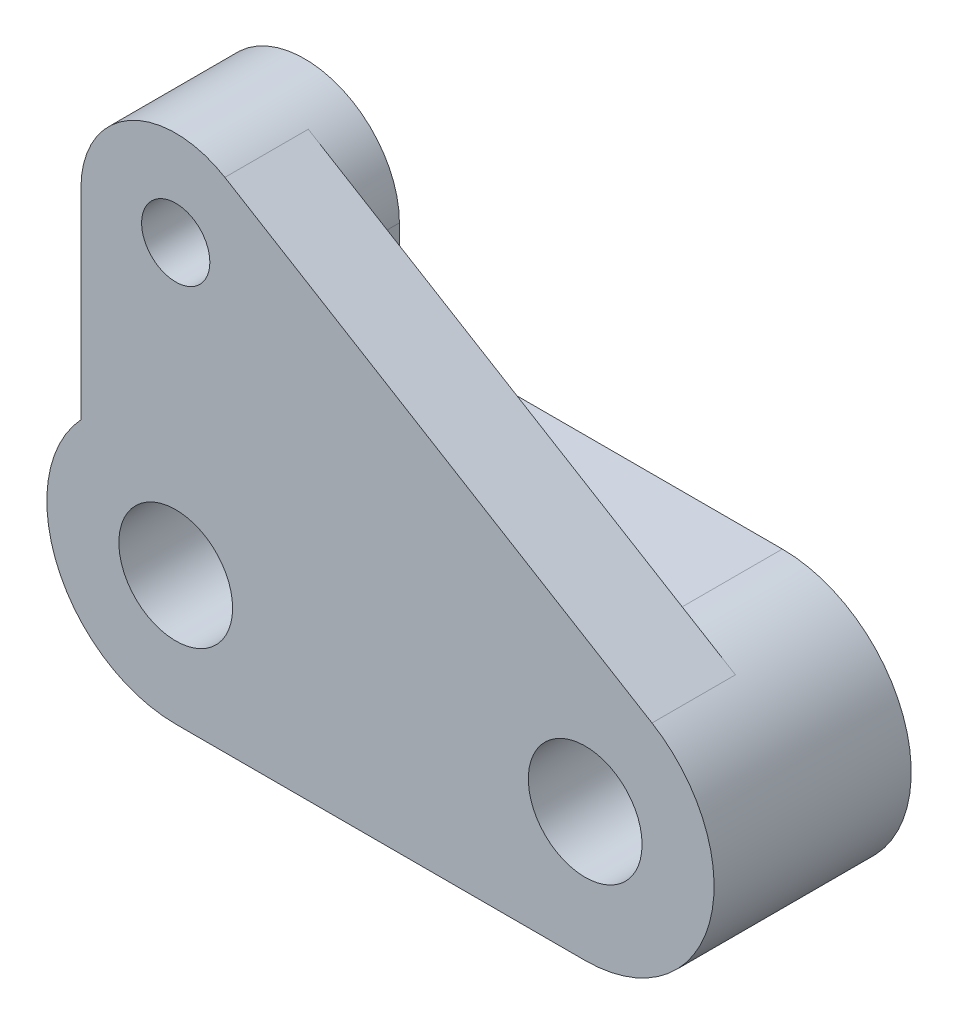
ISO-10303-21;
HEADER;
FILE_DESCRIPTION(('STEP AP214'),'2;1');
FILE_NAME('part.step','',(''),(''),'','','');
FILE_SCHEMA(('AUTOMOTIVE_DESIGN { 1 0 10303 214 1 1 1 1 }'));
ENDSEC;
DATA;
#1=APPLICATION_CONTEXT('core data for automotive mechanical design processes');
#2=APPLICATION_PROTOCOL_DEFINITION('international standard','automotive_design',2000,#1);
#3=PRODUCT_CONTEXT('',#1,'mechanical');
#4=PRODUCT('Part','Part','',(#3));
#5=PRODUCT_RELATED_PRODUCT_CATEGORY('part','',(#4));
#6=PRODUCT_DEFINITION_FORMATION('','',#4);
#7=PRODUCT_DEFINITION_CONTEXT('part definition',#1,'design');
#8=PRODUCT_DEFINITION('design','',#6,#7);
#9=PRODUCT_DEFINITION_SHAPE('','',#8);
#10=(LENGTH_UNIT() NAMED_UNIT(*) SI_UNIT(.MILLI.,.METRE.));
#11=(NAMED_UNIT(*) PLANE_ANGLE_UNIT() SI_UNIT($,.RADIAN.));
#12=(NAMED_UNIT(*) SI_UNIT($,.STERADIAN.) SOLID_ANGLE_UNIT());
#13=UNCERTAINTY_MEASURE_WITH_UNIT(LENGTH_MEASURE(1.E-05),#10,'distance_accuracy_value','');
#14=(GEOMETRIC_REPRESENTATION_CONTEXT(3) GLOBAL_UNCERTAINTY_ASSIGNED_CONTEXT((#13)) GLOBAL_UNIT_ASSIGNED_CONTEXT((#10,
#11,#12)) REPRESENTATION_CONTEXT('',''));
#15=CARTESIAN_POINT('',(0.,0.,0.));
#16=DIRECTION('',(0.,0.,1.));
#17=DIRECTION('',(1.,0.,0.));
#18=AXIS2_PLACEMENT_3D('',#15,#16,#17);
#19=CARTESIAN_POINT('',(54.,0.,26.));
#20=DIRECTION('',(0.,0.,-1.));
#21=DIRECTION('',(-1.,0.,0.));
#22=AXIS2_PLACEMENT_3D('',#19,#20,#21);
#23=CYLINDRICAL_SURFACE('',#22,34.);
#24=DIRECTION('',(0.,0.,1.));
#25=VECTOR('',#24,1.);
#26=CARTESIAN_POINT('',(71.6263298981798,29.0742582763608,4.));
#27=LINE('',#26,#25);
#28=CARTESIAN_POINT('',(71.6263298981798,29.0742582763608,4.));
#29=VERTEX_POINT('',#28);
#30=CARTESIAN_POINT('',(71.6263298981798,29.0742582763608,26.));
#31=VERTEX_POINT('',#30);
#32=EDGE_CURVE('E130',#29,#31,#27,.T.);
#33=ORIENTED_EDGE('',*,*,#32,.T.);
#34=CARTESIAN_POINT('',(54.,0.,26.));
#35=DIRECTION('',(0.,0.,1.));
#36=DIRECTION('',(1.,0.,0.));
#37=AXIS2_PLACEMENT_3D('',#34,#35,#36);
#38=CIRCLE('',#37,34.);
#39=CARTESIAN_POINT('',(54.,-34.,26.));
#40=VERTEX_POINT('',#39);
#41=EDGE_CURVE('E219',#40,#31,#38,.T.);
#42=ORIENTED_EDGE('',*,*,#41,.F.);
#43=DIRECTION('',(0.,0.,-1.));
#44=VECTOR('',#43,1.);
#45=CARTESIAN_POINT('',(54.,-34.,26.));
#46=LINE('',#45,#44);
#47=CARTESIAN_POINT('',(54.,-34.,-26.));
#48=VERTEX_POINT('',#47);
#49=EDGE_CURVE('E242',#40,#48,#46,.T.);
#50=ORIENTED_EDGE('',*,*,#49,.T.);
#51=CARTESIAN_POINT('',(54.,0.,-26.));
#52=DIRECTION('',(0.,0.,1.));
#53=DIRECTION('',(1.,0.,0.));
#54=AXIS2_PLACEMENT_3D('',#51,#52,#53);
#55=CIRCLE('',#54,34.);
#56=CARTESIAN_POINT('',(54.,34.,-26.));
#57=VERTEX_POINT('',#56);
#58=EDGE_CURVE('E230',#48,#57,#55,.T.);
#59=ORIENTED_EDGE('',*,*,#58,.T.);
#60=DIRECTION('',(0.,0.,-1.));
#61=VECTOR('',#60,1.);
#62=CARTESIAN_POINT('',(54.,34.,26.));
#63=LINE('',#62,#61);
#64=CARTESIAN_POINT('',(54.,34.,4.));
#65=VERTEX_POINT('',#64);
#66=EDGE_CURVE('E239',#65,#57,#63,.T.);
#67=ORIENTED_EDGE('',*,*,#66,.F.);
#68=CARTESIAN_POINT('',(54.,0.,4.));
#69=DIRECTION('',(0.,0.,1.));
#70=DIRECTION('',(1.,0.,0.));
#71=AXIS2_PLACEMENT_3D('',#68,#69,#70);
#72=CIRCLE('',#71,34.);
#73=EDGE_CURVE('E134',#29,#65,#72,.T.);
#74=ORIENTED_EDGE('',*,*,#73,.F.);
#75=EDGE_LOOP('',(#33,#42,#50,#59,#67,#74));
#76=FACE_BOUND('',#75,.T.);
#77=ADVANCED_FACE('F39',(#76),#23,.T.);
#78=CARTESIAN_POINT('',(-54.,34.,26.));
#79=DIRECTION('',(0.,-1.,0.));
#80=DIRECTION('',(1.,0.,0.));
#81=AXIS2_PLACEMENT_3D('',#78,#79,#80);
#82=PLANE('',#81);
#83=DIRECTION('',(-1.,0.,0.));
#84=VECTOR('',#83,1.);
#85=CARTESIAN_POINT('',(54.,34.,4.));
#86=LINE('',#85,#84);
#87=CARTESIAN_POINT('',(-14.,34.,4.));
#88=VERTEX_POINT('',#87);
#89=EDGE_CURVE('E256',#65,#88,#86,.T.);
#90=ORIENTED_EDGE('',*,*,#89,.F.);
#91=ORIENTED_EDGE('',*,*,#66,.T.);
#92=DIRECTION('',(-1.,0.,0.));
#93=VECTOR('',#92,1.);
#94=CARTESIAN_POINT('',(-54.,34.,-26.));
#95=LINE('',#94,#93);
#96=CARTESIAN_POINT('',(-54.,34.,-26.));
#97=VERTEX_POINT('',#96);
#98=EDGE_CURVE('E216',#57,#97,#95,.T.);
#99=ORIENTED_EDGE('',*,*,#98,.T.);
#100=DIRECTION('',(0.,0.,-1.));
#101=VECTOR('',#100,1.);
#102=CARTESIAN_POINT('',(-54.,34.,26.));
#103=LINE('',#102,#101);
#104=CARTESIAN_POINT('',(-54.,34.,-8.));
#105=VERTEX_POINT('',#104);
#106=EDGE_CURVE('E223',#105,#97,#103,.T.);
#107=ORIENTED_EDGE('',*,*,#106,.F.);
#108=DIRECTION('',(1.,0.,0.));
#109=VECTOR('',#108,1.);
#110=CARTESIAN_POINT('',(-29.,34.,-8.));
#111=LINE('',#110,#109);
#112=CARTESIAN_POINT('',(-14.,34.,-8.));
#113=VERTEX_POINT('',#112);
#114=EDGE_CURVE('E62',#105,#113,#111,.T.);
#115=ORIENTED_EDGE('',*,*,#114,.T.);
#116=DIRECTION('',(0.,0.,1.));
#117=VECTOR('',#116,1.);
#118=CARTESIAN_POINT('',(-14.,34.,26.));
#119=LINE('',#118,#117);
#120=EDGE_CURVE('E250',#113,#88,#119,.T.);
#121=ORIENTED_EDGE('',*,*,#120,.T.);
#122=EDGE_LOOP('',(#90,#91,#99,#107,#115,#121));
#123=FACE_BOUND('',#122,.T.);
#124=ADVANCED_FACE('F255',(#123),#82,.F.);
#125=CARTESIAN_POINT('',(-29.,76.,-8.));
#126=DIRECTION('',(1.,0.,0.));
#127=DIRECTION('',(0.,1.,0.));
#128=AXIS2_PLACEMENT_3D('',#125,#126,#127);
#129=PLANE('',#128);
#130=DIRECTION('',(0.,0.,1.));
#131=VECTOR('',#130,1.);
#132=CARTESIAN_POINT('',(-29.,76.,-8.));
#133=LINE('',#132,#131);
#134=CARTESIAN_POINT('',(-29.,76.,-8.));
#135=VERTEX_POINT('',#134);
#136=CARTESIAN_POINT('',(-29.,76.,4.));
#137=VERTEX_POINT('',#136);
#138=EDGE_CURVE('E186',#135,#137,#133,.T.);
#139=ORIENTED_EDGE('',*,*,#138,.T.);
#140=DIRECTION('',(0.,1.,0.));
#141=VECTOR('',#140,1.);
#142=CARTESIAN_POINT('',(-29.,49.,4.));
#143=LINE('',#142,#141);
#144=CARTESIAN_POINT('',(-29.,49.,4.));
#145=VERTEX_POINT('',#144);
#146=EDGE_CURVE('E139',#145,#137,#143,.T.);
#147=ORIENTED_EDGE('',*,*,#146,.F.);
#148=DIRECTION('',(0.,0.,1.));
#149=VECTOR('',#148,1.);
#150=CARTESIAN_POINT('',(-29.,49.,-8.));
#151=LINE('',#150,#149);
#152=CARTESIAN_POINT('',(-29.,49.,-8.));
#153=VERTEX_POINT('',#152);
#154=EDGE_CURVE('E48',#145,#153,#151,.F.);
#155=ORIENTED_EDGE('',*,*,#154,.T.);
#156=DIRECTION('',(0.,1.,0.));
#157=VECTOR('',#156,1.);
#158=CARTESIAN_POINT('',(-29.,76.,-8.));
#159=LINE('',#158,#157);
#160=EDGE_CURVE('E180',#153,#135,#159,.T.);
#161=ORIENTED_EDGE('',*,*,#160,.T.);
#162=EDGE_LOOP('',(#139,#147,#155,#161));
#163=FACE_BOUND('',#162,.T.);
#164=ADVANCED_FACE('F297',(#163),#129,.T.);
#165=CARTESIAN_POINT('',(-54.,76.,-8.));
#166=DIRECTION('',(0.,0.,1.));
#167=DIRECTION('',(1.,0.,0.));
#168=AXIS2_PLACEMENT_3D('',#165,#166,#167);
#169=CYLINDRICAL_SURFACE('',#168,25.);
#170=CARTESIAN_POINT('',(-54.,76.,26.));
#171=DIRECTION('',(0.,0.,1.));
#172=DIRECTION('',(1.,0.,0.));
#173=AXIS2_PLACEMENT_3D('',#170,#171,#172);
#174=CIRCLE('',#173,25.);
#175=CARTESIAN_POINT('',(-41.0394633101619,97.3781310855594,26.));
#176=VERTEX_POINT('',#175);
#177=CARTESIAN_POINT('',(-79.,76.,26.));
#178=VERTEX_POINT('',#177);
#179=EDGE_CURVE('E148',#176,#178,#174,.T.);
#180=ORIENTED_EDGE('',*,*,#179,.F.);
#181=DIRECTION('',(0.,0.,1.));
#182=VECTOR('',#181,1.);
#183=CARTESIAN_POINT('',(-41.0394633101619,97.3781310855594,4.));
#184=LINE('',#183,#182);
#185=CARTESIAN_POINT('',(-41.0394633101619,97.3781310855594,4.));
#186=VERTEX_POINT('',#185);
#187=EDGE_CURVE('E127',#186,#176,#184,.T.);
#188=ORIENTED_EDGE('',*,*,#187,.F.);
#189=CARTESIAN_POINT('',(-54.,76.,4.));
#190=DIRECTION('',(0.,0.,1.));
#191=DIRECTION('',(1.,0.,0.));
#192=AXIS2_PLACEMENT_3D('',#189,#190,#191);
#193=CIRCLE('',#192,25.);
#194=EDGE_CURVE('E135',#137,#186,#193,.T.);
#195=ORIENTED_EDGE('',*,*,#194,.F.);
#196=ORIENTED_EDGE('',*,*,#138,.F.);
#197=CARTESIAN_POINT('',(-54.,76.,-8.));
#198=DIRECTION('',(0.,0.,1.));
#199=DIRECTION('',(1.,0.,0.));
#200=AXIS2_PLACEMENT_3D('',#197,#198,#199);
#201=CIRCLE('',#200,25.);
#202=CARTESIAN_POINT('',(-79.,76.,-8.));
#203=VERTEX_POINT('',#202);
#204=EDGE_CURVE('E163',#135,#203,#201,.T.);
#205=ORIENTED_EDGE('',*,*,#204,.T.);
#206=DIRECTION('',(0.,0.,1.));
#207=VECTOR('',#206,1.);
#208=CARTESIAN_POINT('',(-79.,76.,-8.));
#209=LINE('',#208,#207);
#210=EDGE_CURVE('E183',#203,#178,#209,.T.);
#211=ORIENTED_EDGE('',*,*,#210,.T.);
#212=EDGE_LOOP('',(#180,#188,#195,#196,#205,#211));
#213=FACE_BOUND('',#212,.T.);
#214=ADVANCED_FACE('F146',(#213),#169,.T.);
#215=CARTESIAN_POINT('',(-14.,49.,26.));
#216=DIRECTION('',(0.,0.,1.));
#217=DIRECTION('',(1.,0.,0.));
#218=AXIS2_PLACEMENT_3D('',#215,#216,#217);
#219=CYLINDRICAL_SURFACE('',#218,15.);
#220=CARTESIAN_POINT('',(-14.,49.,4.));
#221=DIRECTION('',(0.,0.,1.));
#222=DIRECTION('',(1.,0.,0.));
#223=AXIS2_PLACEMENT_3D('',#220,#221,#222);
#224=CIRCLE('',#223,15.);
#225=EDGE_CURVE('E261',#145,#88,#224,.T.);
#226=ORIENTED_EDGE('',*,*,#225,.T.);
#227=ORIENTED_EDGE('',*,*,#120,.F.);
#228=CARTESIAN_POINT('',(-14.,49.,-8.));
#229=DIRECTION('',(0.,0.,1.));
#230=DIRECTION('',(1.,0.,0.));
#231=AXIS2_PLACEMENT_3D('',#228,#229,#230);
#232=CIRCLE('',#231,15.);
#233=EDGE_CURVE('E11',#153,#113,#232,.T.);
#234=ORIENTED_EDGE('',*,*,#233,.F.);
#235=ORIENTED_EDGE('',*,*,#154,.F.);
#236=EDGE_LOOP('',(#226,#227,#234,#235));
#237=FACE_BOUND('',#236,.T.);
#238=ADVANCED_FACE('F41',(#237),#219,.F.);
#239=CARTESIAN_POINT('',(-54.,0.,26.));
#240=DIRECTION('',(0.,0.,-1.));
#241=DIRECTION('',(-1.,0.,0.));
#242=AXIS2_PLACEMENT_3D('',#239,#240,#241);
#243=CYLINDRICAL_SURFACE('',#242,34.);
#244=CARTESIAN_POINT('',(-54.,0.,26.));
#245=DIRECTION('',(0.,0.,1.));
#246=DIRECTION('',(1.,0.,0.));
#247=AXIS2_PLACEMENT_3D('',#244,#245,#246);
#248=CIRCLE('',#247,34.);
#249=CARTESIAN_POINT('',(-79.,23.0434372436059,26.));
#250=VERTEX_POINT('',#249);
#251=CARTESIAN_POINT('',(-54.,-34.,26.));
#252=VERTEX_POINT('',#251);
#253=EDGE_CURVE('E212',#250,#252,#248,.T.);
#254=ORIENTED_EDGE('',*,*,#253,.F.);
#255=DIRECTION('',(0.,0.,1.));
#256=VECTOR('',#255,1.);
#257=CARTESIAN_POINT('',(-79.,23.0434372436059,-8.));
#258=LINE('',#257,#256);
#259=CARTESIAN_POINT('',(-79.,23.0434372436059,-8.));
#260=VERTEX_POINT('',#259);
#261=EDGE_CURVE('E190',#260,#250,#258,.T.);
#262=ORIENTED_EDGE('',*,*,#261,.F.);
#263=CARTESIAN_POINT('',(-54.,0.,-8.));
#264=DIRECTION('',(0.,0.,-1.));
#265=DIRECTION('',(1.,0.,0.));
#266=AXIS2_PLACEMENT_3D('',#263,#264,#265);
#267=CIRCLE('',#266,34.);
#268=EDGE_CURVE('E174',#260,#105,#267,.T.);
#269=ORIENTED_EDGE('',*,*,#268,.T.);
#270=ORIENTED_EDGE('',*,*,#106,.T.);
#271=CARTESIAN_POINT('',(-54.,0.,-26.));
#272=DIRECTION('',(0.,0.,1.));
#273=DIRECTION('',(1.,0.,0.));
#274=AXIS2_PLACEMENT_3D('',#271,#272,#273);
#275=CIRCLE('',#274,34.);
#276=CARTESIAN_POINT('',(-54.,-34.,-26.));
#277=VERTEX_POINT('',#276);
#278=EDGE_CURVE('E200',#97,#277,#275,.T.);
#279=ORIENTED_EDGE('',*,*,#278,.T.);
#280=DIRECTION('',(0.,0.,-1.));
#281=VECTOR('',#280,1.);
#282=CARTESIAN_POINT('',(-54.,-34.,26.));
#283=LINE('',#282,#281);
#284=EDGE_CURVE('E246',#252,#277,#283,.T.);
#285=ORIENTED_EDGE('',*,*,#284,.F.);
#286=EDGE_LOOP('',(#254,#262,#269,#270,#279,#285));
#287=FACE_BOUND('',#286,.T.);
#288=ADVANCED_FACE('F287',(#287),#243,.T.);
#289=CARTESIAN_POINT('',(-54.,-34.,26.));
#290=DIRECTION('',(0.,1.,0.));
#291=DIRECTION('',(-1.,0.,0.));
#292=AXIS2_PLACEMENT_3D('',#289,#290,#291);
#293=PLANE('',#292);
#294=DIRECTION('',(1.,0.,0.));
#295=VECTOR('',#294,1.);
#296=CARTESIAN_POINT('',(-54.,-34.,-26.));
#297=LINE('',#296,#295);
#298=EDGE_CURVE('E227',#277,#48,#297,.T.);
#299=ORIENTED_EDGE('',*,*,#298,.T.);
#300=ORIENTED_EDGE('',*,*,#49,.F.);
#301=DIRECTION('',(1.,0.,0.));
#302=VECTOR('',#301,1.);
#303=CARTESIAN_POINT('',(-54.,-34.,26.));
#304=LINE('',#303,#302);
#305=EDGE_CURVE('E215',#252,#40,#304,.T.);
#306=ORIENTED_EDGE('',*,*,#305,.F.);
#307=ORIENTED_EDGE('',*,*,#284,.T.);
#308=EDGE_LOOP('',(#299,#300,#306,#307));
#309=FACE_BOUND('',#308,.T.);
#310=ADVANCED_FACE('F280',(#309),#293,.F.);
#311=CARTESIAN_POINT('',(-54.,0.,26.));
#312=DIRECTION('',(0.,0.,1.));
#313=DIRECTION('',(1.,0.,0.));
#314=AXIS2_PLACEMENT_3D('',#311,#312,#313);
#315=PLANE('',#314);
#316=DIRECTION('',(0.855125243422376,-0.518421467593523,0.));
#317=VECTOR('',#316,1.);
#318=CARTESIAN_POINT('',(-41.0394633101619,97.3781310855594,26.));
#319=LINE('',#318,#317);
#320=EDGE_CURVE('E144',#176,#31,#319,.T.);
#321=ORIENTED_EDGE('',*,*,#320,.F.);
#322=ORIENTED_EDGE('',*,*,#179,.T.);
#323=DIRECTION('',(0.,-1.,0.));
#324=VECTOR('',#323,1.);
#325=CARTESIAN_POINT('',(-79.,76.,26.));
#326=LINE('',#325,#324);
#327=EDGE_CURVE('E167',#178,#250,#326,.T.);
#328=ORIENTED_EDGE('',*,*,#327,.T.);
#329=ORIENTED_EDGE('',*,*,#253,.T.);
#330=ORIENTED_EDGE('',*,*,#305,.T.);
#331=ORIENTED_EDGE('',*,*,#41,.T.);
#332=EDGE_LOOP('',(#321,#322,#328,#329,#330,#331));
#333=FACE_BOUND('',#332,.T.);
#334=CARTESIAN_POINT('',(54.,0.,26.));
#335=DIRECTION('',(0.,0.,1.));
#336=DIRECTION('',(1.,0.,0.));
#337=AXIS2_PLACEMENT_3D('',#334,#335,#336);
#338=CIRCLE('',#337,15.);
#339=CARTESIAN_POINT('',(69.,0.,26.));
#340=VERTEX_POINT('',#339);
#341=EDGE_CURVE('E201',#340,#340,#338,.T.);
#342=ORIENTED_EDGE('',*,*,#341,.F.);
#343=EDGE_LOOP('',(#342));
#344=FACE_BOUND('',#343,.T.);
#345=CARTESIAN_POINT('',(-54.,0.,26.));
#346=DIRECTION('',(0.,0.,1.));
#347=DIRECTION('',(1.,0.,0.));
#348=AXIS2_PLACEMENT_3D('',#345,#346,#347);
#349=CIRCLE('',#348,15.);
#350=CARTESIAN_POINT('',(-39.,0.,26.));
#351=VERTEX_POINT('',#350);
#352=EDGE_CURVE('E189',#351,#351,#349,.T.);
#353=ORIENTED_EDGE('',*,*,#352,.F.);
#354=EDGE_LOOP('',(#353));
#355=FACE_BOUND('',#354,.T.);
#356=CARTESIAN_POINT('',(-54.,76.,26.));
#357=DIRECTION('',(0.,0.,1.));
#358=DIRECTION('',(1.,0.,0.));
#359=AXIS2_PLACEMENT_3D('',#356,#357,#358);
#360=CIRCLE('',#359,8.99999999999999);
#361=CARTESIAN_POINT('',(-45.,76.,26.));
#362=VERTEX_POINT('',#361);
#363=EDGE_CURVE('E150',#362,#362,#360,.T.);
#364=ORIENTED_EDGE('',*,*,#363,.F.);
#365=EDGE_LOOP('',(#364));
#366=FACE_BOUND('',#365,.T.);
#367=ADVANCED_FACE('F273',(#333,#344,#355,#366),#315,.T.);
#368=CARTESIAN_POINT('',(-54.,0.,-26.));
#369=DIRECTION('',(0.,0.,1.));
#370=DIRECTION('',(1.,0.,0.));
#371=AXIS2_PLACEMENT_3D('',#368,#369,#370);
#372=PLANE('',#371);
#373=CARTESIAN_POINT('',(54.,0.,-26.));
#374=DIRECTION('',(0.,0.,1.));
#375=DIRECTION('',(1.,0.,0.));
#376=AXIS2_PLACEMENT_3D('',#373,#374,#375);
#377=CIRCLE('',#376,15.);
#378=CARTESIAN_POINT('',(69.,0.,-26.));
#379=VERTEX_POINT('',#378);
#380=EDGE_CURVE('E196',#379,#379,#377,.T.);
#381=ORIENTED_EDGE('',*,*,#380,.T.);
#382=EDGE_LOOP('',(#381));
#383=FACE_BOUND('',#382,.T.);
#384=CARTESIAN_POINT('',(-54.,0.,-26.));
#385=DIRECTION('',(0.,0.,1.));
#386=DIRECTION('',(1.,0.,0.));
#387=AXIS2_PLACEMENT_3D('',#384,#385,#386);
#388=CIRCLE('',#387,15.);
#389=CARTESIAN_POINT('',(-39.,0.,-26.));
#390=VERTEX_POINT('',#389);
#391=EDGE_CURVE('E205',#390,#390,#388,.T.);
#392=ORIENTED_EDGE('',*,*,#391,.T.);
#393=EDGE_LOOP('',(#392));
#394=FACE_BOUND('',#393,.T.);
#395=ORIENTED_EDGE('',*,*,#278,.F.);
#396=ORIENTED_EDGE('',*,*,#98,.F.);
#397=ORIENTED_EDGE('',*,*,#58,.F.);
#398=ORIENTED_EDGE('',*,*,#298,.F.);
#399=EDGE_LOOP('',(#395,#396,#397,#398));
#400=FACE_BOUND('',#399,.T.);
#401=ADVANCED_FACE('F285',(#383,#394,#400),#372,.F.);
#402=CARTESIAN_POINT('',(-54.,0.,-26.));
#403=DIRECTION('',(0.,0.,1.));
#404=DIRECTION('',(1.,0.,0.));
#405=AXIS2_PLACEMENT_3D('',#402,#403,#404);
#406=CYLINDRICAL_SURFACE('',#405,15.);
#407=CARTESIAN_POINT('',(-39.,0.,-26.));
#408=CARTESIAN_POINT('',(-39.,0.,-25.4583333333333));
#409=CARTESIAN_POINT('',(-39.,0.,-24.9166666666667));
#410=CARTESIAN_POINT('',(-39.,0.,-23.8333333333333));
#411=CARTESIAN_POINT('',(-39.,0.,-23.2916666666667));
#412=CARTESIAN_POINT('',(-39.,0.,-22.2083333333333));
#413=CARTESIAN_POINT('',(-39.,0.,-21.6666666666667));
#414=CARTESIAN_POINT('',(-39.,0.,-20.5833333333333));
#415=CARTESIAN_POINT('',(-39.,0.,-20.0416666666667));
#416=CARTESIAN_POINT('',(-39.,0.,-18.9583333333333));
#417=CARTESIAN_POINT('',(-39.,0.,-18.4166666666667));
#418=CARTESIAN_POINT('',(-39.,0.,-17.3333333333333));
#419=CARTESIAN_POINT('',(-39.,0.,-16.7916666666667));
#420=CARTESIAN_POINT('',(-39.,0.,-15.7083333333333));
#421=CARTESIAN_POINT('',(-39.,0.,-15.1666666666667));
#422=CARTESIAN_POINT('',(-39.,0.,-14.0833333333333));
#423=CARTESIAN_POINT('',(-39.,0.,-13.5416666666667));
#424=CARTESIAN_POINT('',(-39.,0.,-12.4583333333333));
#425=CARTESIAN_POINT('',(-39.,0.,-11.9166666666667));
#426=CARTESIAN_POINT('',(-39.,0.,-10.8333333333333));
#427=CARTESIAN_POINT('',(-39.,0.,-10.2916666666667));
#428=CARTESIAN_POINT('',(-39.,0.,-9.20833333333333));
#429=CARTESIAN_POINT('',(-39.,0.,-8.66666666666667));
#430=CARTESIAN_POINT('',(-39.,0.,-7.58333333333333));
#431=CARTESIAN_POINT('',(-39.,0.,-7.04166666666667));
#432=CARTESIAN_POINT('',(-39.,0.,-5.95833333333333));
#433=CARTESIAN_POINT('',(-39.,0.,-5.41666666666667));
#434=CARTESIAN_POINT('',(-39.,0.,-4.33333333333333));
#435=CARTESIAN_POINT('',(-39.,0.,-3.79166666666667));
#436=CARTESIAN_POINT('',(-39.,0.,-2.70833333333333));
#437=CARTESIAN_POINT('',(-39.,0.,-2.16666666666667));
#438=CARTESIAN_POINT('',(-39.,0.,-1.08333333333333));
#439=CARTESIAN_POINT('',(-39.,0.,-0.541666666666667));
#440=CARTESIAN_POINT('',(-39.,0.,0.541666666666667));
#441=CARTESIAN_POINT('',(-39.,0.,1.08333333333333));
#442=CARTESIAN_POINT('',(-39.,0.,2.16666666666667));
#443=CARTESIAN_POINT('',(-39.,0.,2.70833333333333));
#444=CARTESIAN_POINT('',(-39.,0.,3.79166666666667));
#445=CARTESIAN_POINT('',(-39.,0.,4.33333333333333));
#446=CARTESIAN_POINT('',(-39.,0.,5.41666666666667));
#447=CARTESIAN_POINT('',(-39.,0.,5.95833333333333));
#448=CARTESIAN_POINT('',(-39.,0.,7.04166666666666));
#449=CARTESIAN_POINT('',(-39.,0.,7.58333333333333));
#450=CARTESIAN_POINT('',(-39.,0.,8.66666666666666));
#451=CARTESIAN_POINT('',(-39.,0.,9.20833333333333));
#452=CARTESIAN_POINT('',(-39.,0.,10.2916666666667));
#453=CARTESIAN_POINT('',(-39.,0.,10.8333333333333));
#454=CARTESIAN_POINT('',(-39.,0.,11.9166666666667));
#455=CARTESIAN_POINT('',(-39.,0.,12.4583333333333));
#456=CARTESIAN_POINT('',(-39.,0.,13.5416666666667));
#457=CARTESIAN_POINT('',(-39.,0.,14.0833333333333));
#458=CARTESIAN_POINT('',(-39.,0.,15.1666666666667));
#459=CARTESIAN_POINT('',(-39.,0.,15.7083333333333));
#460=CARTESIAN_POINT('',(-39.,0.,16.7916666666667));
#461=CARTESIAN_POINT('',(-39.,0.,17.3333333333333));
#462=CARTESIAN_POINT('',(-39.,0.,18.4166666666667));
#463=CARTESIAN_POINT('',(-39.,0.,18.9583333333333));
#464=CARTESIAN_POINT('',(-39.,0.,20.0416666666667));
#465=CARTESIAN_POINT('',(-39.,0.,20.5833333333333));
#466=CARTESIAN_POINT('',(-39.,0.,21.6666666666667));
#467=CARTESIAN_POINT('',(-39.,0.,22.2083333333333));
#468=CARTESIAN_POINT('',(-39.,0.,23.2916666666667));
#469=CARTESIAN_POINT('',(-39.,0.,23.8333333333333));
#470=CARTESIAN_POINT('',(-39.,0.,24.9166666666667));
#471=CARTESIAN_POINT('',(-39.,0.,25.4583333333333));
#472=CARTESIAN_POINT('',(-39.,0.,26.));
#473=B_SPLINE_CURVE_WITH_KNOTS('',3,(#407,#408,#409,#410,#411,#412,#413,#414,#415,#416,#417,
#418,#419,#420,#421,#422,#423,#424,#425,#426,#427,#428,#429,#430,#431,#432,#433,#434,#435,#436,
#437,#438,#439,#440,#441,#442,#443,#444,#445,#446,#447,#448,#449,#450,#451,#452,#453,#454,#455,
#456,#457,#458,#459,#460,#461,#462,#463,#464,#465,#466,#467,#468,#469,#470,#471,#472),
.UNSPECIFIED.,.F.,.F.,(4,2,2,2,2,2,2,2,2,2,2,2,2,2,2,2,2,2,2,2,2,2,2,2,2,2,2,2,2,2,2,2,4),(0.,
1.625,3.25,4.875,6.5,8.125,9.75,11.375,13.,14.625,16.25,17.875,19.5,21.125,22.75,24.375,26.,
27.625,29.25,30.875,32.5,34.125,35.75,37.375,39.,40.625,42.25,43.875,45.5,47.125,48.75,50.375,
52.),.UNSPECIFIED.);
#474=EDGE_CURVE('BSEAM383',#390,#351,#473,.T.);
#475=ORIENTED_EDGE('',*,*,#391,.F.);
#476=ORIENTED_EDGE('',*,*,#352,.T.);
#477=ORIENTED_EDGE('',*,*,#474,.T.);
#478=ORIENTED_EDGE('',*,*,#474,.F.);
#479=EDGE_LOOP('',(#475,#477,#476,#478));
#480=FACE_BOUND('',#479,.T.);
#481=ADVANCED_FACE('F383',(#480),#406,.F.);
#482=CARTESIAN_POINT('',(54.,0.,-26.));
#483=DIRECTION('',(0.,0.,1.));
#484=DIRECTION('',(1.,0.,0.));
#485=AXIS2_PLACEMENT_3D('',#482,#483,#484);
#486=CYLINDRICAL_SURFACE('',#485,15.);
#487=CARTESIAN_POINT('',(69.,0.,-26.));
#488=CARTESIAN_POINT('',(69.,0.,-25.4583333333333));
#489=CARTESIAN_POINT('',(69.,0.,-24.9166666666667));
#490=CARTESIAN_POINT('',(69.,0.,-23.8333333333333));
#491=CARTESIAN_POINT('',(69.,0.,-23.2916666666667));
#492=CARTESIAN_POINT('',(69.,0.,-22.2083333333333));
#493=CARTESIAN_POINT('',(69.,0.,-21.6666666666667));
#494=CARTESIAN_POINT('',(69.,0.,-20.5833333333333));
#495=CARTESIAN_POINT('',(69.,0.,-20.0416666666667));
#496=CARTESIAN_POINT('',(69.,0.,-18.9583333333333));
#497=CARTESIAN_POINT('',(69.,0.,-18.4166666666667));
#498=CARTESIAN_POINT('',(69.,0.,-17.3333333333333));
#499=CARTESIAN_POINT('',(69.,0.,-16.7916666666667));
#500=CARTESIAN_POINT('',(69.,0.,-15.7083333333333));
#501=CARTESIAN_POINT('',(69.,0.,-15.1666666666667));
#502=CARTESIAN_POINT('',(69.,0.,-14.0833333333333));
#503=CARTESIAN_POINT('',(69.,0.,-13.5416666666667));
#504=CARTESIAN_POINT('',(69.,0.,-12.4583333333333));
#505=CARTESIAN_POINT('',(69.,0.,-11.9166666666667));
#506=CARTESIAN_POINT('',(69.,0.,-10.8333333333333));
#507=CARTESIAN_POINT('',(69.,0.,-10.2916666666667));
#508=CARTESIAN_POINT('',(69.,0.,-9.20833333333333));
#509=CARTESIAN_POINT('',(69.,0.,-8.66666666666667));
#510=CARTESIAN_POINT('',(69.,0.,-7.58333333333333));
#511=CARTESIAN_POINT('',(69.,0.,-7.04166666666667));
#512=CARTESIAN_POINT('',(69.,0.,-5.95833333333333));
#513=CARTESIAN_POINT('',(69.,0.,-5.41666666666667));
#514=CARTESIAN_POINT('',(69.,0.,-4.33333333333333));
#515=CARTESIAN_POINT('',(69.,0.,-3.79166666666667));
#516=CARTESIAN_POINT('',(69.,0.,-2.70833333333333));
#517=CARTESIAN_POINT('',(69.,0.,-2.16666666666667));
#518=CARTESIAN_POINT('',(69.,0.,-1.08333333333333));
#519=CARTESIAN_POINT('',(69.,0.,-0.541666666666667));
#520=CARTESIAN_POINT('',(69.,0.,0.541666666666667));
#521=CARTESIAN_POINT('',(69.,0.,1.08333333333333));
#522=CARTESIAN_POINT('',(69.,0.,2.16666666666667));
#523=CARTESIAN_POINT('',(69.,0.,2.70833333333333));
#524=CARTESIAN_POINT('',(69.,0.,3.79166666666667));
#525=CARTESIAN_POINT('',(69.,0.,4.33333333333333));
#526=CARTESIAN_POINT('',(69.,0.,5.41666666666667));
#527=CARTESIAN_POINT('',(69.,0.,5.95833333333333));
#528=CARTESIAN_POINT('',(69.,0.,7.04166666666666));
#529=CARTESIAN_POINT('',(69.,0.,7.58333333333333));
#530=CARTESIAN_POINT('',(69.,0.,8.66666666666666));
#531=CARTESIAN_POINT('',(69.,0.,9.20833333333333));
#532=CARTESIAN_POINT('',(69.,0.,10.2916666666667));
#533=CARTESIAN_POINT('',(69.,0.,10.8333333333333));
#534=CARTESIAN_POINT('',(69.,0.,11.9166666666667));
#535=CARTESIAN_POINT('',(69.,0.,12.4583333333333));
#536=CARTESIAN_POINT('',(69.,0.,13.5416666666667));
#537=CARTESIAN_POINT('',(69.,0.,14.0833333333333));
#538=CARTESIAN_POINT('',(69.,0.,15.1666666666667));
#539=CARTESIAN_POINT('',(69.,0.,15.7083333333333));
#540=CARTESIAN_POINT('',(69.,0.,16.7916666666667));
#541=CARTESIAN_POINT('',(69.,0.,17.3333333333333));
#542=CARTESIAN_POINT('',(69.,0.,18.4166666666667));
#543=CARTESIAN_POINT('',(69.,0.,18.9583333333333));
#544=CARTESIAN_POINT('',(69.,0.,20.0416666666667));
#545=CARTESIAN_POINT('',(69.,0.,20.5833333333333));
#546=CARTESIAN_POINT('',(69.,0.,21.6666666666667));
#547=CARTESIAN_POINT('',(69.,0.,22.2083333333333));
#548=CARTESIAN_POINT('',(69.,0.,23.2916666666667));
#549=CARTESIAN_POINT('',(69.,0.,23.8333333333333));
#550=CARTESIAN_POINT('',(69.,0.,24.9166666666667));
#551=CARTESIAN_POINT('',(69.,0.,25.4583333333333));
#552=CARTESIAN_POINT('',(69.,0.,26.));
#553=B_SPLINE_CURVE_WITH_KNOTS('',3,(#487,#488,#489,#490,#491,#492,#493,#494,#495,#496,#497,
#498,#499,#500,#501,#502,#503,#504,#505,#506,#507,#508,#509,#510,#511,#512,#513,#514,#515,#516,
#517,#518,#519,#520,#521,#522,#523,#524,#525,#526,#527,#528,#529,#530,#531,#532,#533,#534,#535,
#536,#537,#538,#539,#540,#541,#542,#543,#544,#545,#546,#547,#548,#549,#550,#551,#552),
.UNSPECIFIED.,.F.,.F.,(4,2,2,2,2,2,2,2,2,2,2,2,2,2,2,2,2,2,2,2,2,2,2,2,2,2,2,2,2,2,2,2,4),(0.,
1.625,3.25,4.875,6.5,8.125,9.75,11.375,13.,14.625,16.25,17.875,19.5,21.125,22.75,24.375,26.,
27.625,29.25,30.875,32.5,34.125,35.75,37.375,39.,40.625,42.25,43.875,45.5,47.125,48.75,50.375,
52.),.UNSPECIFIED.);
#554=EDGE_CURVE('BSEAM369',#379,#340,#553,.T.);
#555=ORIENTED_EDGE('',*,*,#380,.F.);
#556=ORIENTED_EDGE('',*,*,#341,.T.);
#557=ORIENTED_EDGE('',*,*,#554,.T.);
#558=ORIENTED_EDGE('',*,*,#554,.F.);
#559=EDGE_LOOP('',(#555,#557,#556,#558));
#560=FACE_BOUND('',#559,.T.);
#561=ADVANCED_FACE('F369',(#560),#486,.F.);
#562=CARTESIAN_POINT('',(-79.,76.,-8.));
#563=DIRECTION('',(-1.,0.,0.));
#564=DIRECTION('',(0.,0.,1.));
#565=AXIS2_PLACEMENT_3D('',#562,#563,#564);
#566=PLANE('',#565);
#567=ORIENTED_EDGE('',*,*,#327,.F.);
#568=ORIENTED_EDGE('',*,*,#210,.F.);
#569=DIRECTION('',(0.,-1.,0.));
#570=VECTOR('',#569,1.);
#571=CARTESIAN_POINT('',(-79.,76.,-8.));
#572=LINE('',#571,#570);
#573=EDGE_CURVE('E170',#203,#260,#572,.T.);
#574=ORIENTED_EDGE('',*,*,#573,.T.);
#575=ORIENTED_EDGE('',*,*,#261,.T.);
#576=EDGE_LOOP('',(#567,#568,#574,#575));
#577=FACE_BOUND('',#576,.T.);
#578=ADVANCED_FACE('F296',(#577),#566,.T.);
#579=CARTESIAN_POINT('',(-54.,76.,-8.));
#580=DIRECTION('',(0.,0.,1.));
#581=DIRECTION('',(1.,0.,0.));
#582=AXIS2_PLACEMENT_3D('',#579,#580,#581);
#583=PLANE('',#582);
#584=ORIENTED_EDGE('',*,*,#573,.F.);
#585=ORIENTED_EDGE('',*,*,#204,.F.);
#586=ORIENTED_EDGE('',*,*,#160,.F.);
#587=ORIENTED_EDGE('',*,*,#233,.T.);
#588=ORIENTED_EDGE('',*,*,#114,.F.);
#589=ORIENTED_EDGE('',*,*,#268,.F.);
#590=EDGE_LOOP('',(#584,#585,#586,#587,#588,#589));
#591=FACE_BOUND('',#590,.T.);
#592=CARTESIAN_POINT('',(-54.,76.,-8.));
#593=DIRECTION('',(0.,0.,1.));
#594=DIRECTION('',(1.,0.,0.));
#595=AXIS2_PLACEMENT_3D('',#592,#593,#594);
#596=CIRCLE('',#595,8.99999999999999);
#597=CARTESIAN_POINT('',(-45.,76.,-8.));
#598=VERTEX_POINT('',#597);
#599=EDGE_CURVE('E155',#598,#598,#596,.T.);
#600=ORIENTED_EDGE('',*,*,#599,.T.);
#601=EDGE_LOOP('',(#600));
#602=FACE_BOUND('',#601,.T.);
#603=ADVANCED_FACE('F290',(#591,#602),#583,.F.);
#604=CARTESIAN_POINT('',(-54.,76.,-8.));
#605=DIRECTION('',(0.,0.,1.));
#606=DIRECTION('',(1.,0.,0.));
#607=AXIS2_PLACEMENT_3D('',#604,#605,#606);
#608=CYLINDRICAL_SURFACE('',#607,8.99999999999999);
#609=ORIENTED_EDGE('',*,*,#599,.F.);
#610=EDGE_LOOP('',(#609));
#611=FACE_BOUND('',#610,.T.);
#612=ORIENTED_EDGE('',*,*,#363,.T.);
#613=EDGE_LOOP('',(#612));
#614=FACE_BOUND('',#613,.T.);
#615=ADVANCED_FACE('F350',(#611,#614),#608,.F.);
#616=CARTESIAN_POINT('',(-41.0394633101619,97.3781310855594,4.));
#617=DIRECTION('',(-0.518421467593523,-0.855125243422376,0.));
#618=DIRECTION('',(0.855125243422376,-0.518421467593523,0.));
#619=AXIS2_PLACEMENT_3D('',#616,#617,#618);
#620=PLANE('',#619);
#621=ORIENTED_EDGE('',*,*,#320,.T.);
#622=ORIENTED_EDGE('',*,*,#32,.F.);
#623=DIRECTION('',(0.855125243422376,-0.518421467593523,0.));
#624=VECTOR('',#623,1.);
#625=CARTESIAN_POINT('',(-41.0394633101619,97.3781310855594,4.));
#626=LINE('',#625,#624);
#627=EDGE_CURVE('E123',#186,#29,#626,.T.);
#628=ORIENTED_EDGE('',*,*,#627,.F.);
#629=ORIENTED_EDGE('',*,*,#187,.T.);
#630=EDGE_LOOP('',(#621,#622,#628,#629));
#631=FACE_BOUND('',#630,.T.);
#632=ADVANCED_FACE('F125',(#631),#620,.F.);
#633=CARTESIAN_POINT('',(-54.,76.,4.));
#634=DIRECTION('',(0.,0.,1.));
#635=DIRECTION('',(1.,0.,0.));
#636=AXIS2_PLACEMENT_3D('',#633,#634,#635);
#637=PLANE('',#636);
#638=ORIENTED_EDGE('',*,*,#194,.T.);
#639=ORIENTED_EDGE('',*,*,#627,.T.);
#640=ORIENTED_EDGE('',*,*,#73,.T.);
#641=ORIENTED_EDGE('',*,*,#89,.T.);
#642=ORIENTED_EDGE('',*,*,#225,.F.);
#643=ORIENTED_EDGE('',*,*,#146,.T.);
#644=EDGE_LOOP('',(#638,#639,#640,#641,#642,#643));
#645=FACE_BOUND('',#644,.T.);
#646=ADVANCED_FACE('F138',(#645),#637,.F.);
#647=CLOSED_SHELL('',(#77,#124,#164,#214,#238,#288,#310,#367,#401,#481,#561,#578,#603,#615,#632,#646));
#648=MANIFOLD_SOLID_BREP('B2',#647);
#649=ADVANCED_BREP_SHAPE_REPRESENTATION('',(#18,#648),#14);
#650=SHAPE_DEFINITION_REPRESENTATION(#9,#649);
ENDSEC;
END-ISO-10303-21;
